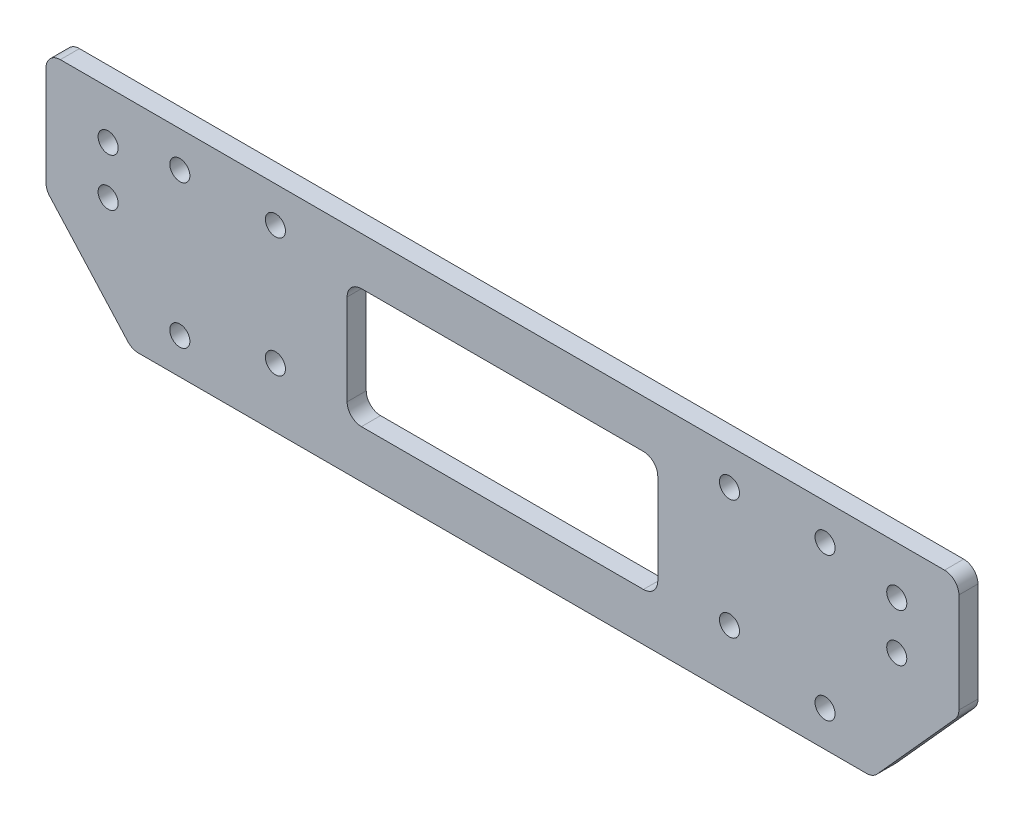
ISO-10303-21;
HEADER;
FILE_DESCRIPTION(('STEP AP214'),'2;1');
FILE_NAME('part.step','',(''),(''),'','','');
FILE_SCHEMA(('AUTOMOTIVE_DESIGN { 1 0 10303 214 1 1 1 1 }'));
ENDSEC;
DATA;
#1=APPLICATION_CONTEXT('core data for automotive mechanical design processes');
#2=APPLICATION_PROTOCOL_DEFINITION('international standard','automotive_design',2000,#1);
#3=PRODUCT_CONTEXT('',#1,'mechanical');
#4=PRODUCT('Part','Part','',(#3));
#5=PRODUCT_RELATED_PRODUCT_CATEGORY('part','',(#4));
#6=PRODUCT_DEFINITION_FORMATION('','',#4);
#7=PRODUCT_DEFINITION_CONTEXT('part definition',#1,'design');
#8=PRODUCT_DEFINITION('design','',#6,#7);
#9=PRODUCT_DEFINITION_SHAPE('','',#8);
#10=(LENGTH_UNIT() NAMED_UNIT(*) SI_UNIT(.MILLI.,.METRE.));
#11=(NAMED_UNIT(*) PLANE_ANGLE_UNIT() SI_UNIT($,.RADIAN.));
#12=(NAMED_UNIT(*) SI_UNIT($,.STERADIAN.) SOLID_ANGLE_UNIT());
#13=UNCERTAINTY_MEASURE_WITH_UNIT(LENGTH_MEASURE(1.E-05),#10,'distance_accuracy_value','');
#14=(GEOMETRIC_REPRESENTATION_CONTEXT(3) GLOBAL_UNCERTAINTY_ASSIGNED_CONTEXT((#13)) GLOBAL_UNIT_ASSIGNED_CONTEXT((#10,
#11,#12)) REPRESENTATION_CONTEXT('',''));
#15=CARTESIAN_POINT('',(0.,0.,0.));
#16=DIRECTION('',(0.,0.,1.));
#17=DIRECTION('',(1.,0.,0.));
#18=AXIS2_PLACEMENT_3D('',#15,#16,#17);
#19=CARTESIAN_POINT('',(0.,0.,4.));
#20=DIRECTION('',(0.,0.,-1.));
#21=DIRECTION('',(-1.,0.,0.));
#22=AXIS2_PLACEMENT_3D('',#19,#20,#21);
#23=PLANE('',#22);
#24=DIRECTION('',(-1.,0.,0.));
#25=VECTOR('',#24,1.);
#26=CARTESIAN_POINT('',(-32.5,12.5,4.));
#27=LINE('',#26,#25);
#28=CARTESIAN_POINT('',(29.5,12.5,4.));
#29=VERTEX_POINT('',#28);
#30=CARTESIAN_POINT('',(-29.5,12.5,4.));
#31=VERTEX_POINT('',#30);
#32=EDGE_CURVE('E289',#29,#31,#27,.T.);
#33=ORIENTED_EDGE('',*,*,#32,.F.);
#34=CARTESIAN_POINT('',(29.5,9.5,4.));
#35=DIRECTION('',(0.,0.,-1.));
#36=DIRECTION('',(-1.,0.,0.));
#37=AXIS2_PLACEMENT_3D('',#34,#35,#36);
#38=CIRCLE('',#37,3.);
#39=CARTESIAN_POINT('',(32.5,9.5,4.));
#40=VERTEX_POINT('',#39);
#41=EDGE_CURVE('E47',#29,#40,#38,.T.);
#42=ORIENTED_EDGE('',*,*,#41,.T.);
#43=DIRECTION('',(0.,1.,0.));
#44=VECTOR('',#43,1.);
#45=CARTESIAN_POINT('',(32.5,-12.5,4.));
#46=LINE('',#45,#44);
#47=CARTESIAN_POINT('',(32.5,-9.5,4.));
#48=VERTEX_POINT('',#47);
#49=EDGE_CURVE('E287',#48,#40,#46,.T.);
#50=ORIENTED_EDGE('',*,*,#49,.F.);
#51=CARTESIAN_POINT('',(29.5,-9.5,4.));
#52=DIRECTION('',(0.,0.,-1.));
#53=DIRECTION('',(-1.,0.,0.));
#54=AXIS2_PLACEMENT_3D('',#51,#52,#53);
#55=CIRCLE('',#54,3.);
#56=CARTESIAN_POINT('',(29.5,-12.5,4.));
#57=VERTEX_POINT('',#56);
#58=EDGE_CURVE('E272',#48,#57,#55,.T.);
#59=ORIENTED_EDGE('',*,*,#58,.T.);
#60=DIRECTION('',(1.,0.,0.));
#61=VECTOR('',#60,1.);
#62=CARTESIAN_POINT('',(-32.5,-12.5,4.));
#63=LINE('',#62,#61);
#64=CARTESIAN_POINT('',(-29.5,-12.5,4.));
#65=VERTEX_POINT('',#64);
#66=EDGE_CURVE('E336',#65,#57,#63,.T.);
#67=ORIENTED_EDGE('',*,*,#66,.F.);
#68=CARTESIAN_POINT('',(-29.5,-9.5,4.));
#69=DIRECTION('',(0.,0.,-1.));
#70=DIRECTION('',(-1.,0.,0.));
#71=AXIS2_PLACEMENT_3D('',#68,#69,#70);
#72=CIRCLE('',#71,3.);
#73=CARTESIAN_POINT('',(-32.5,-9.5,4.));
#74=VERTEX_POINT('',#73);
#75=EDGE_CURVE('E276',#65,#74,#72,.T.);
#76=ORIENTED_EDGE('',*,*,#75,.T.);
#77=DIRECTION('',(0.,-1.,0.));
#78=VECTOR('',#77,1.);
#79=CARTESIAN_POINT('',(-32.5,-12.5,4.));
#80=LINE('',#79,#78);
#81=CARTESIAN_POINT('',(-32.5,9.5,4.));
#82=VERTEX_POINT('',#81);
#83=EDGE_CURVE('E335',#82,#74,#80,.T.);
#84=ORIENTED_EDGE('',*,*,#83,.F.);
#85=CARTESIAN_POINT('',(-29.5,9.5,4.));
#86=DIRECTION('',(0.,0.,-1.));
#87=DIRECTION('',(-1.,0.,0.));
#88=AXIS2_PLACEMENT_3D('',#85,#86,#87);
#89=CIRCLE('',#88,3.);
#90=EDGE_CURVE('E280',#82,#31,#89,.T.);
#91=ORIENTED_EDGE('',*,*,#90,.T.);
#92=EDGE_LOOP('',(#33,#42,#50,#59,#67,#76,#84,#91));
#93=FACE_BOUND('',#92,.T.);
#94=DIRECTION('',(0.,-1.,0.));
#95=VECTOR('',#94,1.);
#96=CARTESIAN_POINT('',(-95.5,22.5,4.));
#97=LINE('',#96,#95);
#98=CARTESIAN_POINT('',(-95.5,19.5,4.));
#99=VERTEX_POINT('',#98);
#100=CARTESIAN_POINT('',(-95.5,-1.34879198430876,4.));
#101=VERTEX_POINT('',#100);
#102=EDGE_CURVE('E180',#99,#101,#97,.T.);
#103=ORIENTED_EDGE('',*,*,#102,.T.);
#104=CARTESIAN_POINT('',(-92.5,-1.34879198430876,4.));
#105=DIRECTION('',(0.,0.,-1.));
#106=DIRECTION('',(-1.,0.,0.));
#107=AXIS2_PLACEMENT_3D('',#104,#105,#106);
#108=CIRCLE('',#107,3.);
#109=CARTESIAN_POINT('',(-94.7298824387415,-3.35568617917611,4.));
#110=VERTEX_POINT('',#109);
#111=EDGE_CURVE('E218',#101,#110,#108,.F.);
#112=ORIENTED_EDGE('',*,*,#111,.T.);
#113=DIRECTION('',(0.66896473162245,-0.743294146247166,0.));
#114=VECTOR('',#113,1.);
#115=CARTESIAN_POINT('',(-95.5,-2.5,4.));
#116=LINE('',#115,#114);
#117=CARTESIAN_POINT('',(-78.3937952246194,-21.5068941948673,4.));
#118=VERTEX_POINT('',#117);
#119=EDGE_CURVE('E197',#110,#118,#116,.T.);
#120=ORIENTED_EDGE('',*,*,#119,.T.);
#121=CARTESIAN_POINT('',(-76.1639127858779,-19.5,4.));
#122=DIRECTION('',(0.,0.,-1.));
#123=DIRECTION('',(-1.,0.,0.));
#124=AXIS2_PLACEMENT_3D('',#121,#122,#123);
#125=CIRCLE('',#124,3.);
#126=CARTESIAN_POINT('',(-76.1639127858779,-22.5,4.));
#127=VERTEX_POINT('',#126);
#128=EDGE_CURVE('E216',#118,#127,#125,.F.);
#129=ORIENTED_EDGE('',*,*,#128,.T.);
#130=DIRECTION('',(1.,0.,0.));
#131=VECTOR('',#130,1.);
#132=CARTESIAN_POINT('',(-77.5,-22.5,4.));
#133=LINE('',#132,#131);
#134=CARTESIAN_POINT('',(76.1639127858779,-22.5,4.));
#135=VERTEX_POINT('',#134);
#136=EDGE_CURVE('E311',#127,#135,#133,.T.);
#137=ORIENTED_EDGE('',*,*,#136,.T.);
#138=CARTESIAN_POINT('',(76.1639127858779,-19.5,4.));
#139=DIRECTION('',(0.,0.,-1.));
#140=DIRECTION('',(-1.,0.,0.));
#141=AXIS2_PLACEMENT_3D('',#138,#139,#140);
#142=CIRCLE('',#141,3.);
#143=CARTESIAN_POINT('',(78.3937952246194,-21.5068941948673,4.));
#144=VERTEX_POINT('',#143);
#145=EDGE_CURVE('E214',#135,#144,#142,.F.);
#146=ORIENTED_EDGE('',*,*,#145,.T.);
#147=DIRECTION('',(0.66896473162245,0.743294146247166,0.));
#148=VECTOR('',#147,1.);
#149=CARTESIAN_POINT('',(95.5,-2.5,4.));
#150=LINE('',#149,#148);
#151=CARTESIAN_POINT('',(94.7298824387415,-3.35568617917611,4.));
#152=VERTEX_POINT('',#151);
#153=EDGE_CURVE('E407',#144,#152,#150,.T.);
#154=ORIENTED_EDGE('',*,*,#153,.T.);
#155=CARTESIAN_POINT('',(92.5,-1.34879198430876,4.));
#156=DIRECTION('',(0.,0.,-1.));
#157=DIRECTION('',(-1.,0.,0.));
#158=AXIS2_PLACEMENT_3D('',#155,#156,#157);
#159=CIRCLE('',#158,3.);
#160=CARTESIAN_POINT('',(95.5,-1.34879198430876,4.));
#161=VERTEX_POINT('',#160);
#162=EDGE_CURVE('E212',#152,#161,#159,.F.);
#163=ORIENTED_EDGE('',*,*,#162,.T.);
#164=DIRECTION('',(0.,1.,0.));
#165=VECTOR('',#164,1.);
#166=CARTESIAN_POINT('',(95.5,22.5,4.));
#167=LINE('',#166,#165);
#168=CARTESIAN_POINT('',(95.5,19.5,4.));
#169=VERTEX_POINT('',#168);
#170=EDGE_CURVE('E413',#161,#169,#167,.T.);
#171=ORIENTED_EDGE('',*,*,#170,.T.);
#172=CARTESIAN_POINT('',(92.5,19.5,4.));
#173=DIRECTION('',(0.,0.,-1.));
#174=DIRECTION('',(-1.,0.,0.));
#175=AXIS2_PLACEMENT_3D('',#172,#173,#174);
#176=CIRCLE('',#175,3.);
#177=CARTESIAN_POINT('',(92.5,22.5,4.));
#178=VERTEX_POINT('',#177);
#179=EDGE_CURVE('E187',#169,#178,#176,.F.);
#180=ORIENTED_EDGE('',*,*,#179,.T.);
#181=DIRECTION('',(-1.,0.,0.));
#182=VECTOR('',#181,1.);
#183=CARTESIAN_POINT('',(-77.5,22.5,4.));
#184=LINE('',#183,#182);
#185=CARTESIAN_POINT('',(-92.5,22.5,4.));
#186=VERTEX_POINT('',#185);
#187=EDGE_CURVE('E182',#178,#186,#184,.T.);
#188=ORIENTED_EDGE('',*,*,#187,.T.);
#189=CARTESIAN_POINT('',(-92.5,19.5,4.));
#190=DIRECTION('',(0.,0.,-1.));
#191=DIRECTION('',(-1.,0.,0.));
#192=AXIS2_PLACEMENT_3D('',#189,#190,#191);
#193=CIRCLE('',#192,3.);
#194=EDGE_CURVE('E177',#186,#99,#193,.F.);
#195=ORIENTED_EDGE('',*,*,#194,.T.);
#196=EDGE_LOOP('',(#103,#112,#120,#129,#137,#146,#154,#163,#171,#180,#188,#195));
#197=FACE_BOUND('',#196,.T.);
#198=CARTESIAN_POINT('',(-67.5,15.,4.));
#199=DIRECTION('',(0.,0.,1.));
#200=DIRECTION('',(1.,0.,0.));
#201=AXIS2_PLACEMENT_3D('',#198,#199,#200);
#202=CIRCLE('',#201,2.1);
#203=CARTESIAN_POINT('',(-65.4,15.,4.));
#204=VERTEX_POINT('',#203);
#205=EDGE_CURVE('E388',#204,#204,#202,.T.);
#206=ORIENTED_EDGE('',*,*,#205,.F.);
#207=EDGE_LOOP('',(#206));
#208=FACE_BOUND('',#207,.T.);
#209=CARTESIAN_POINT('',(-67.5,-15.,4.));
#210=DIRECTION('',(0.,0.,1.));
#211=DIRECTION('',(1.,0.,0.));
#212=AXIS2_PLACEMENT_3D('',#209,#210,#211);
#213=CIRCLE('',#212,2.1);
#214=CARTESIAN_POINT('',(-65.4,-15.,4.));
#215=VERTEX_POINT('',#214);
#216=EDGE_CURVE('E382',#215,#215,#213,.T.);
#217=ORIENTED_EDGE('',*,*,#216,.F.);
#218=EDGE_LOOP('',(#217));
#219=FACE_BOUND('',#218,.T.);
#220=CARTESIAN_POINT('',(47.5,15.,4.));
#221=DIRECTION('',(0.,0.,1.));
#222=DIRECTION('',(1.,0.,0.));
#223=AXIS2_PLACEMENT_3D('',#220,#221,#222);
#224=CIRCLE('',#223,2.1);
#225=CARTESIAN_POINT('',(49.6,15.,4.));
#226=VERTEX_POINT('',#225);
#227=EDGE_CURVE('E376',#226,#226,#224,.T.);
#228=ORIENTED_EDGE('',*,*,#227,.F.);
#229=EDGE_LOOP('',(#228));
#230=FACE_BOUND('',#229,.T.);
#231=CARTESIAN_POINT('',(-47.5,15.,4.));
#232=DIRECTION('',(0.,0.,1.));
#233=DIRECTION('',(1.,0.,0.));
#234=AXIS2_PLACEMENT_3D('',#231,#232,#233);
#235=CIRCLE('',#234,2.1);
#236=CARTESIAN_POINT('',(-45.4,15.,4.));
#237=VERTEX_POINT('',#236);
#238=EDGE_CURVE('E370',#237,#237,#235,.T.);
#239=ORIENTED_EDGE('',*,*,#238,.F.);
#240=EDGE_LOOP('',(#239));
#241=FACE_BOUND('',#240,.T.);
#242=CARTESIAN_POINT('',(67.5,15.,4.));
#243=DIRECTION('',(0.,0.,1.));
#244=DIRECTION('',(-1.,0.,0.));
#245=AXIS2_PLACEMENT_3D('',#242,#243,#244);
#246=CIRCLE('',#245,2.0999999999999);
#247=CARTESIAN_POINT('',(65.4000000000001,15.,4.));
#248=VERTEX_POINT('',#247);
#249=EDGE_CURVE('E364',#248,#248,#246,.T.);
#250=ORIENTED_EDGE('',*,*,#249,.F.);
#251=EDGE_LOOP('',(#250));
#252=FACE_BOUND('',#251,.T.);
#253=CARTESIAN_POINT('',(67.5,-15.,4.));
#254=DIRECTION('',(0.,0.,1.));
#255=DIRECTION('',(-1.,0.,0.));
#256=AXIS2_PLACEMENT_3D('',#253,#254,#255);
#257=CIRCLE('',#256,2.09999999999996);
#258=CARTESIAN_POINT('',(65.4,-15.,4.));
#259=VERTEX_POINT('',#258);
#260=EDGE_CURVE('E358',#259,#259,#257,.T.);
#261=ORIENTED_EDGE('',*,*,#260,.F.);
#262=EDGE_LOOP('',(#261));
#263=FACE_BOUND('',#262,.T.);
#264=CARTESIAN_POINT('',(47.5,-9.99999999999999,4.));
#265=DIRECTION('',(0.,0.,1.));
#266=DIRECTION('',(1.,0.,0.));
#267=AXIS2_PLACEMENT_3D('',#264,#265,#266);
#268=CIRCLE('',#267,2.1);
#269=CARTESIAN_POINT('',(49.6,-9.99999999999999,4.));
#270=VERTEX_POINT('',#269);
#271=EDGE_CURVE('E352',#270,#270,#268,.T.);
#272=ORIENTED_EDGE('',*,*,#271,.F.);
#273=EDGE_LOOP('',(#272));
#274=FACE_BOUND('',#273,.T.);
#275=CARTESIAN_POINT('',(-47.5,-10.,4.));
#276=DIRECTION('',(0.,0.,1.));
#277=DIRECTION('',(1.,0.,0.));
#278=AXIS2_PLACEMENT_3D('',#275,#276,#277);
#279=CIRCLE('',#278,2.1);
#280=CARTESIAN_POINT('',(-45.4,-10.,4.));
#281=VERTEX_POINT('',#280);
#282=EDGE_CURVE('E346',#281,#281,#279,.T.);
#283=ORIENTED_EDGE('',*,*,#282,.F.);
#284=EDGE_LOOP('',(#283));
#285=FACE_BOUND('',#284,.T.);
#286=CARTESIAN_POINT('',(-82.5,2.5,4.));
#287=DIRECTION('',(0.,0.,1.));
#288=DIRECTION('',(1.,0.,0.));
#289=AXIS2_PLACEMENT_3D('',#286,#287,#288);
#290=CIRCLE('',#289,2.1);
#291=CARTESIAN_POINT('',(-80.4,2.5,4.));
#292=VERTEX_POINT('',#291);
#293=EDGE_CURVE('E433',#292,#292,#290,.T.);
#294=ORIENTED_EDGE('',*,*,#293,.F.);
#295=EDGE_LOOP('',(#294));
#296=FACE_BOUND('',#295,.T.);
#297=CARTESIAN_POINT('',(-82.5,12.5,4.));
#298=DIRECTION('',(0.,0.,1.));
#299=DIRECTION('',(1.,0.,0.));
#300=AXIS2_PLACEMENT_3D('',#297,#298,#299);
#301=CIRCLE('',#300,2.1);
#302=CARTESIAN_POINT('',(-80.4,12.5,4.));
#303=VERTEX_POINT('',#302);
#304=EDGE_CURVE('E785',#303,#303,#301,.T.);
#305=ORIENTED_EDGE('',*,*,#304,.F.);
#306=EDGE_LOOP('',(#305));
#307=FACE_BOUND('',#306,.T.);
#308=CARTESIAN_POINT('',(82.5,2.5,4.));
#309=DIRECTION('',(0.,0.,1.));
#310=DIRECTION('',(-1.,0.,0.));
#311=AXIS2_PLACEMENT_3D('',#308,#309,#310);
#312=CIRCLE('',#311,2.1);
#313=CARTESIAN_POINT('',(80.4,2.5,4.));
#314=VERTEX_POINT('',#313);
#315=EDGE_CURVE('E430',#314,#314,#312,.T.);
#316=ORIENTED_EDGE('',*,*,#315,.F.);
#317=EDGE_LOOP('',(#316));
#318=FACE_BOUND('',#317,.T.);
#319=CARTESIAN_POINT('',(82.5,12.5,4.));
#320=DIRECTION('',(0.,0.,1.));
#321=DIRECTION('',(-1.,0.,0.));
#322=AXIS2_PLACEMENT_3D('',#319,#320,#321);
#323=CIRCLE('',#322,2.1);
#324=CARTESIAN_POINT('',(80.4,12.5,4.));
#325=VERTEX_POINT('',#324);
#326=EDGE_CURVE('E416',#325,#325,#323,.T.);
#327=ORIENTED_EDGE('',*,*,#326,.F.);
#328=EDGE_LOOP('',(#327));
#329=FACE_BOUND('',#328,.T.);
#330=ADVANCED_FACE('F39',(#93,#197,#208,#219,#230,#241,#252,#263,#274,#285,#296,#307,#318,#329),
#23,.F.);
#331=CARTESIAN_POINT('',(0.,0.,0.));
#332=DIRECTION('',(0.,0.,-1.));
#333=DIRECTION('',(-1.,0.,0.));
#334=AXIS2_PLACEMENT_3D('',#331,#332,#333);
#335=PLANE('',#334);
#336=DIRECTION('',(0.,-1.,0.));
#337=VECTOR('',#336,1.);
#338=CARTESIAN_POINT('',(32.5,0.,0.));
#339=LINE('',#338,#337);
#340=CARTESIAN_POINT('',(32.5,9.5,0.));
#341=VERTEX_POINT('',#340);
#342=CARTESIAN_POINT('',(32.5,-9.5,0.));
#343=VERTEX_POINT('',#342);
#344=EDGE_CURVE('E203',#341,#343,#339,.T.);
#345=ORIENTED_EDGE('',*,*,#344,.F.);
#346=CARTESIAN_POINT('',(29.5,9.5,0.));
#347=DIRECTION('',(0.,0.,-1.));
#348=DIRECTION('',(-1.,0.,0.));
#349=AXIS2_PLACEMENT_3D('',#346,#347,#348);
#350=CIRCLE('',#349,3.);
#351=CARTESIAN_POINT('',(29.5,12.5,0.));
#352=VERTEX_POINT('',#351);
#353=EDGE_CURVE('E11',#341,#352,#350,.F.);
#354=ORIENTED_EDGE('',*,*,#353,.T.);
#355=DIRECTION('',(1.,0.,0.));
#356=VECTOR('',#355,1.);
#357=CARTESIAN_POINT('',(0.,12.5,0.));
#358=LINE('',#357,#356);
#359=CARTESIAN_POINT('',(-29.5,12.5,0.));
#360=VERTEX_POINT('',#359);
#361=EDGE_CURVE('E305',#360,#352,#358,.T.);
#362=ORIENTED_EDGE('',*,*,#361,.F.);
#363=CARTESIAN_POINT('',(-29.5,9.5,0.));
#364=DIRECTION('',(0.,0.,-1.));
#365=DIRECTION('',(-1.,0.,0.));
#366=AXIS2_PLACEMENT_3D('',#363,#364,#365);
#367=CIRCLE('',#366,3.);
#368=CARTESIAN_POINT('',(-32.5,9.5,0.));
#369=VERTEX_POINT('',#368);
#370=EDGE_CURVE('E282',#360,#369,#367,.F.);
#371=ORIENTED_EDGE('',*,*,#370,.T.);
#372=DIRECTION('',(0.,1.,0.));
#373=VECTOR('',#372,1.);
#374=CARTESIAN_POINT('',(-32.5,0.,0.));
#375=LINE('',#374,#373);
#376=CARTESIAN_POINT('',(-32.5,-9.5,0.));
#377=VERTEX_POINT('',#376);
#378=EDGE_CURVE('E310',#377,#369,#375,.T.);
#379=ORIENTED_EDGE('',*,*,#378,.F.);
#380=CARTESIAN_POINT('',(-29.5,-9.5,0.));
#381=DIRECTION('',(0.,0.,-1.));
#382=DIRECTION('',(-1.,0.,0.));
#383=AXIS2_PLACEMENT_3D('',#380,#381,#382);
#384=CIRCLE('',#383,3.);
#385=CARTESIAN_POINT('',(-29.5,-12.5,0.));
#386=VERTEX_POINT('',#385);
#387=EDGE_CURVE('E278',#377,#386,#384,.F.);
#388=ORIENTED_EDGE('',*,*,#387,.T.);
#389=DIRECTION('',(-1.,0.,0.));
#390=VECTOR('',#389,1.);
#391=CARTESIAN_POINT('',(0.,-12.5,0.));
#392=LINE('',#391,#390);
#393=CARTESIAN_POINT('',(29.5,-12.5,0.));
#394=VERTEX_POINT('',#393);
#395=EDGE_CURVE('E207',#394,#386,#392,.T.);
#396=ORIENTED_EDGE('',*,*,#395,.F.);
#397=CARTESIAN_POINT('',(29.5,-9.5,0.));
#398=DIRECTION('',(0.,0.,-1.));
#399=DIRECTION('',(-1.,0.,0.));
#400=AXIS2_PLACEMENT_3D('',#397,#398,#399);
#401=CIRCLE('',#400,3.);
#402=EDGE_CURVE('E274',#394,#343,#401,.F.);
#403=ORIENTED_EDGE('',*,*,#402,.T.);
#404=EDGE_LOOP('',(#345,#354,#362,#371,#379,#388,#396,#403));
#405=FACE_BOUND('',#404,.T.);
#406=CARTESIAN_POINT('',(47.5,-9.99999999999999,0.));
#407=DIRECTION('',(0.,0.,1.));
#408=DIRECTION('',(1.,0.,0.));
#409=AXIS2_PLACEMENT_3D('',#406,#407,#408);
#410=CIRCLE('',#409,2.1);
#411=CARTESIAN_POINT('',(49.6,-9.99999999999999,0.));
#412=VERTEX_POINT('',#411);
#413=EDGE_CURVE('E349',#412,#412,#410,.T.);
#414=ORIENTED_EDGE('',*,*,#413,.T.);
#415=EDGE_LOOP('',(#414));
#416=FACE_BOUND('',#415,.T.);
#417=CARTESIAN_POINT('',(67.5,15.,0.));
#418=DIRECTION('',(0.,0.,1.));
#419=DIRECTION('',(-1.,0.,0.));
#420=AXIS2_PLACEMENT_3D('',#417,#418,#419);
#421=CIRCLE('',#420,2.0999999999999);
#422=CARTESIAN_POINT('',(65.4000000000001,15.,0.));
#423=VERTEX_POINT('',#422);
#424=EDGE_CURVE('E361',#423,#423,#421,.T.);
#425=ORIENTED_EDGE('',*,*,#424,.T.);
#426=EDGE_LOOP('',(#425));
#427=FACE_BOUND('',#426,.T.);
#428=CARTESIAN_POINT('',(47.5,15.,0.));
#429=DIRECTION('',(0.,0.,1.));
#430=DIRECTION('',(1.,0.,0.));
#431=AXIS2_PLACEMENT_3D('',#428,#429,#430);
#432=CIRCLE('',#431,2.1);
#433=CARTESIAN_POINT('',(49.6,15.,0.));
#434=VERTEX_POINT('',#433);
#435=EDGE_CURVE('E373',#434,#434,#432,.T.);
#436=ORIENTED_EDGE('',*,*,#435,.T.);
#437=EDGE_LOOP('',(#436));
#438=FACE_BOUND('',#437,.T.);
#439=CARTESIAN_POINT('',(-67.5,15.,0.));
#440=DIRECTION('',(0.,0.,1.));
#441=DIRECTION('',(1.,0.,0.));
#442=AXIS2_PLACEMENT_3D('',#439,#440,#441);
#443=CIRCLE('',#442,2.1);
#444=CARTESIAN_POINT('',(-65.4,15.,0.));
#445=VERTEX_POINT('',#444);
#446=EDGE_CURVE('E385',#445,#445,#443,.T.);
#447=ORIENTED_EDGE('',*,*,#446,.T.);
#448=EDGE_LOOP('',(#447));
#449=FACE_BOUND('',#448,.T.);
#450=DIRECTION('',(0.66896473162245,-0.743294146247166,0.));
#451=VECTOR('',#450,1.);
#452=CARTESIAN_POINT('',(-95.5,-2.5,0.));
#453=LINE('',#452,#451);
#454=CARTESIAN_POINT('',(-94.7298824387415,-3.35568617917611,0.));
#455=VERTEX_POINT('',#454);
#456=CARTESIAN_POINT('',(-78.3937952246194,-21.5068941948673,0.));
#457=VERTEX_POINT('',#456);
#458=EDGE_CURVE('E297',#455,#457,#453,.T.);
#459=ORIENTED_EDGE('',*,*,#458,.F.);
#460=CARTESIAN_POINT('',(-92.5,-1.34879198430876,0.));
#461=DIRECTION('',(0.,0.,-1.));
#462=DIRECTION('',(-1.,0.,0.));
#463=AXIS2_PLACEMENT_3D('',#460,#461,#462);
#464=CIRCLE('',#463,3.);
#465=CARTESIAN_POINT('',(-95.5,-1.34879198430876,0.));
#466=VERTEX_POINT('',#465);
#467=EDGE_CURVE('E231',#455,#466,#464,.T.);
#468=ORIENTED_EDGE('',*,*,#467,.T.);
#469=DIRECTION('',(0.,-1.,0.));
#470=VECTOR('',#469,1.);
#471=CARTESIAN_POINT('',(-95.5,22.5,0.));
#472=LINE('',#471,#470);
#473=CARTESIAN_POINT('',(-95.5,19.5,0.));
#474=VERTEX_POINT('',#473);
#475=EDGE_CURVE('E779',#474,#466,#472,.T.);
#476=ORIENTED_EDGE('',*,*,#475,.F.);
#477=CARTESIAN_POINT('',(-92.5,19.5,0.));
#478=DIRECTION('',(0.,0.,-1.));
#479=DIRECTION('',(-1.,0.,0.));
#480=AXIS2_PLACEMENT_3D('',#477,#478,#479);
#481=CIRCLE('',#480,3.);
#482=CARTESIAN_POINT('',(-92.5,22.5,0.));
#483=VERTEX_POINT('',#482);
#484=EDGE_CURVE('E202',#474,#483,#481,.T.);
#485=ORIENTED_EDGE('',*,*,#484,.T.);
#486=DIRECTION('',(-1.,0.,0.));
#487=VECTOR('',#486,1.);
#488=CARTESIAN_POINT('',(-77.5,22.5,0.));
#489=LINE('',#488,#487);
#490=CARTESIAN_POINT('',(92.5,22.5,0.));
#491=VERTEX_POINT('',#490);
#492=EDGE_CURVE('E391',#491,#483,#489,.T.);
#493=ORIENTED_EDGE('',*,*,#492,.F.);
#494=CARTESIAN_POINT('',(92.5,19.5,0.));
#495=DIRECTION('',(0.,0.,-1.));
#496=DIRECTION('',(-1.,0.,0.));
#497=AXIS2_PLACEMENT_3D('',#494,#495,#496);
#498=CIRCLE('',#497,3.);
#499=CARTESIAN_POINT('',(95.5,19.5,0.));
#500=VERTEX_POINT('',#499);
#501=EDGE_CURVE('E225',#491,#500,#498,.T.);
#502=ORIENTED_EDGE('',*,*,#501,.T.);
#503=DIRECTION('',(0.,1.,0.));
#504=VECTOR('',#503,1.);
#505=CARTESIAN_POINT('',(95.5,22.5,0.));
#506=LINE('',#505,#504);
#507=CARTESIAN_POINT('',(95.5,-1.34879198430876,0.));
#508=VERTEX_POINT('',#507);
#509=EDGE_CURVE('E423',#508,#500,#506,.T.);
#510=ORIENTED_EDGE('',*,*,#509,.F.);
#511=CARTESIAN_POINT('',(92.5,-1.34879198430876,0.));
#512=DIRECTION('',(0.,0.,-1.));
#513=DIRECTION('',(-1.,0.,0.));
#514=AXIS2_PLACEMENT_3D('',#511,#512,#513);
#515=CIRCLE('',#514,3.);
#516=CARTESIAN_POINT('',(94.7298824387415,-3.35568617917611,0.));
#517=VERTEX_POINT('',#516);
#518=EDGE_CURVE('E227',#508,#517,#515,.T.);
#519=ORIENTED_EDGE('',*,*,#518,.T.);
#520=DIRECTION('',(0.66896473162245,0.743294146247166,0.));
#521=VECTOR('',#520,1.);
#522=CARTESIAN_POINT('',(95.5,-2.5,0.));
#523=LINE('',#522,#521);
#524=CARTESIAN_POINT('',(78.3937952246194,-21.5068941948673,0.));
#525=VERTEX_POINT('',#524);
#526=EDGE_CURVE('E419',#525,#517,#523,.T.);
#527=ORIENTED_EDGE('',*,*,#526,.F.);
#528=CARTESIAN_POINT('',(76.1639127858779,-19.5,0.));
#529=DIRECTION('',(0.,0.,-1.));
#530=DIRECTION('',(-1.,0.,0.));
#531=AXIS2_PLACEMENT_3D('',#528,#529,#530);
#532=CIRCLE('',#531,3.);
#533=CARTESIAN_POINT('',(76.1639127858779,-22.5,0.));
#534=VERTEX_POINT('',#533);
#535=EDGE_CURVE('E54',#525,#534,#532,.T.);
#536=ORIENTED_EDGE('',*,*,#535,.T.);
#537=DIRECTION('',(1.,0.,0.));
#538=VECTOR('',#537,1.);
#539=CARTESIAN_POINT('',(-77.5,-22.5,0.));
#540=LINE('',#539,#538);
#541=CARTESIAN_POINT('',(-76.1639127858779,-22.5,0.));
#542=VERTEX_POINT('',#541);
#543=EDGE_CURVE('E318',#542,#534,#540,.T.);
#544=ORIENTED_EDGE('',*,*,#543,.F.);
#545=CARTESIAN_POINT('',(-76.1639127858779,-19.5,0.));
#546=DIRECTION('',(0.,0.,-1.));
#547=DIRECTION('',(-1.,0.,0.));
#548=AXIS2_PLACEMENT_3D('',#545,#546,#547);
#549=CIRCLE('',#548,3.);
#550=EDGE_CURVE('E62',#542,#457,#549,.T.);
#551=ORIENTED_EDGE('',*,*,#550,.T.);
#552=EDGE_LOOP('',(#459,#468,#476,#485,#493,#502,#510,#519,#527,#536,#544,#551));
#553=FACE_BOUND('',#552,.T.);
#554=CARTESIAN_POINT('',(-67.5,-15.,0.));
#555=DIRECTION('',(0.,0.,1.));
#556=DIRECTION('',(1.,0.,0.));
#557=AXIS2_PLACEMENT_3D('',#554,#555,#556);
#558=CIRCLE('',#557,2.1);
#559=CARTESIAN_POINT('',(-65.4,-15.,0.));
#560=VERTEX_POINT('',#559);
#561=EDGE_CURVE('E379',#560,#560,#558,.T.);
#562=ORIENTED_EDGE('',*,*,#561,.T.);
#563=EDGE_LOOP('',(#562));
#564=FACE_BOUND('',#563,.T.);
#565=CARTESIAN_POINT('',(-47.5,15.,0.));
#566=DIRECTION('',(0.,0.,1.));
#567=DIRECTION('',(1.,0.,0.));
#568=AXIS2_PLACEMENT_3D('',#565,#566,#567);
#569=CIRCLE('',#568,2.1);
#570=CARTESIAN_POINT('',(-45.4,15.,0.));
#571=VERTEX_POINT('',#570);
#572=EDGE_CURVE('E367',#571,#571,#569,.T.);
#573=ORIENTED_EDGE('',*,*,#572,.T.);
#574=EDGE_LOOP('',(#573));
#575=FACE_BOUND('',#574,.T.);
#576=CARTESIAN_POINT('',(67.5,-15.,0.));
#577=DIRECTION('',(0.,0.,1.));
#578=DIRECTION('',(-1.,0.,0.));
#579=AXIS2_PLACEMENT_3D('',#576,#577,#578);
#580=CIRCLE('',#579,2.09999999999996);
#581=CARTESIAN_POINT('',(65.4,-15.,0.));
#582=VERTEX_POINT('',#581);
#583=EDGE_CURVE('E355',#582,#582,#580,.T.);
#584=ORIENTED_EDGE('',*,*,#583,.T.);
#585=EDGE_LOOP('',(#584));
#586=FACE_BOUND('',#585,.T.);
#587=CARTESIAN_POINT('',(-47.5,-10.,0.));
#588=DIRECTION('',(0.,0.,1.));
#589=DIRECTION('',(1.,0.,0.));
#590=AXIS2_PLACEMENT_3D('',#587,#588,#589);
#591=CIRCLE('',#590,2.1);
#592=CARTESIAN_POINT('',(-45.4,-10.,0.));
#593=VERTEX_POINT('',#592);
#594=EDGE_CURVE('E342',#593,#593,#591,.T.);
#595=ORIENTED_EDGE('',*,*,#594,.T.);
#596=EDGE_LOOP('',(#595));
#597=FACE_BOUND('',#596,.T.);
#598=CARTESIAN_POINT('',(-82.5,2.5,0.));
#599=DIRECTION('',(0.,0.,1.));
#600=DIRECTION('',(1.,0.,0.));
#601=AXIS2_PLACEMENT_3D('',#598,#599,#600);
#602=CIRCLE('',#601,2.1);
#603=CARTESIAN_POINT('',(-80.4,2.5,0.));
#604=VERTEX_POINT('',#603);
#605=EDGE_CURVE('E788',#604,#604,#602,.T.);
#606=ORIENTED_EDGE('',*,*,#605,.T.);
#607=EDGE_LOOP('',(#606));
#608=FACE_BOUND('',#607,.T.);
#609=CARTESIAN_POINT('',(-82.5,12.5,0.));
#610=DIRECTION('',(0.,0.,1.));
#611=DIRECTION('',(1.,0.,0.));
#612=AXIS2_PLACEMENT_3D('',#609,#610,#611);
#613=CIRCLE('',#612,2.1);
#614=CARTESIAN_POINT('',(-80.4,12.5,0.));
#615=VERTEX_POINT('',#614);
#616=EDGE_CURVE('E198',#615,#615,#613,.T.);
#617=ORIENTED_EDGE('',*,*,#616,.T.);
#618=EDGE_LOOP('',(#617));
#619=FACE_BOUND('',#618,.T.);
#620=CARTESIAN_POINT('',(82.5,2.5,0.));
#621=DIRECTION('',(0.,0.,1.));
#622=DIRECTION('',(-1.,0.,0.));
#623=AXIS2_PLACEMENT_3D('',#620,#621,#622);
#624=CIRCLE('',#623,2.1);
#625=CARTESIAN_POINT('',(80.4,2.5,0.));
#626=VERTEX_POINT('',#625);
#627=EDGE_CURVE('E428',#626,#626,#624,.T.);
#628=ORIENTED_EDGE('',*,*,#627,.T.);
#629=EDGE_LOOP('',(#628));
#630=FACE_BOUND('',#629,.T.);
#631=CARTESIAN_POINT('',(82.5,12.5,0.));
#632=DIRECTION('',(0.,0.,1.));
#633=DIRECTION('',(-1.,0.,0.));
#634=AXIS2_PLACEMENT_3D('',#631,#632,#633);
#635=CIRCLE('',#634,2.1);
#636=CARTESIAN_POINT('',(80.4,12.5,0.));
#637=VERTEX_POINT('',#636);
#638=EDGE_CURVE('E412',#637,#637,#635,.T.);
#639=ORIENTED_EDGE('',*,*,#638,.T.);
#640=EDGE_LOOP('',(#639));
#641=FACE_BOUND('',#640,.T.);
#642=ADVANCED_FACE('F303',(#405,#416,#427,#438,#449,#553,#564,#575,#586,#597,#608,#619,#630,
#641),#335,.T.);
#643=CARTESIAN_POINT('',(-77.5,22.5,4.));
#644=DIRECTION('',(0.,-1.,0.));
#645=DIRECTION('',(0.,0.,-1.));
#646=AXIS2_PLACEMENT_3D('',#643,#644,#645);
#647=PLANE('',#646);
#648=ORIENTED_EDGE('',*,*,#187,.F.);
#649=DIRECTION('',(0.,0.,1.));
#650=VECTOR('',#649,1.);
#651=CARTESIAN_POINT('',(92.5,22.5,0.));
#652=LINE('',#651,#650);
#653=EDGE_CURVE('E250',#178,#491,#652,.F.);
#654=ORIENTED_EDGE('',*,*,#653,.T.);
#655=ORIENTED_EDGE('',*,*,#492,.T.);
#656=DIRECTION('',(0.,0.,1.));
#657=VECTOR('',#656,1.);
#658=CARTESIAN_POINT('',(-92.5,22.5,4.));
#659=LINE('',#658,#657);
#660=EDGE_CURVE('E248',#483,#186,#659,.T.);
#661=ORIENTED_EDGE('',*,*,#660,.T.);
#662=EDGE_LOOP('',(#648,#654,#655,#661));
#663=FACE_BOUND('',#662,.T.);
#664=ADVANCED_FACE('F507',(#663),#647,.F.);
#665=CARTESIAN_POINT('',(-77.5,-22.5,4.));
#666=DIRECTION('',(0.,1.,0.));
#667=DIRECTION('',(0.,0.,1.));
#668=AXIS2_PLACEMENT_3D('',#665,#666,#667);
#669=PLANE('',#668);
#670=ORIENTED_EDGE('',*,*,#136,.F.);
#671=DIRECTION('',(0.,0.,-1.));
#672=VECTOR('',#671,1.);
#673=CARTESIAN_POINT('',(-76.1639127858779,-22.5,0.));
#674=LINE('',#673,#672);
#675=EDGE_CURVE('E235',#127,#542,#674,.T.);
#676=ORIENTED_EDGE('',*,*,#675,.T.);
#677=ORIENTED_EDGE('',*,*,#543,.T.);
#678=DIRECTION('',(0.,0.,-1.));
#679=VECTOR('',#678,1.);
#680=CARTESIAN_POINT('',(76.1639127858779,-22.5,4.));
#681=LINE('',#680,#679);
#682=EDGE_CURVE('E233',#534,#135,#681,.F.);
#683=ORIENTED_EDGE('',*,*,#682,.T.);
#684=EDGE_LOOP('',(#670,#676,#677,#683));
#685=FACE_BOUND('',#684,.T.);
#686=ADVANCED_FACE('F400',(#685),#669,.F.);
#687=CARTESIAN_POINT('',(-67.5,15.,4.));
#688=DIRECTION('',(0.,0.,-1.));
#689=DIRECTION('',(-1.,0.,0.));
#690=AXIS2_PLACEMENT_3D('',#687,#688,#689);
#691=CYLINDRICAL_SURFACE('',#690,2.1);
#692=ORIENTED_EDGE('',*,*,#205,.T.);
#693=EDGE_LOOP('',(#692));
#694=FACE_BOUND('',#693,.T.);
#695=ORIENTED_EDGE('',*,*,#446,.F.);
#696=EDGE_LOOP('',(#695));
#697=FACE_BOUND('',#696,.T.);
#698=ADVANCED_FACE('F500',(#694,#697),#691,.F.);
#699=CARTESIAN_POINT('',(-67.5,-15.,4.));
#700=DIRECTION('',(0.,0.,-1.));
#701=DIRECTION('',(-1.,0.,0.));
#702=AXIS2_PLACEMENT_3D('',#699,#700,#701);
#703=CYLINDRICAL_SURFACE('',#702,2.1);
#704=ORIENTED_EDGE('',*,*,#216,.T.);
#705=EDGE_LOOP('',(#704));
#706=FACE_BOUND('',#705,.T.);
#707=ORIENTED_EDGE('',*,*,#561,.F.);
#708=EDGE_LOOP('',(#707));
#709=FACE_BOUND('',#708,.T.);
#710=ADVANCED_FACE('F496',(#706,#709),#703,.F.);
#711=CARTESIAN_POINT('',(47.5,15.,4.));
#712=DIRECTION('',(0.,0.,-1.));
#713=DIRECTION('',(-1.,0.,0.));
#714=AXIS2_PLACEMENT_3D('',#711,#712,#713);
#715=CYLINDRICAL_SURFACE('',#714,2.1);
#716=ORIENTED_EDGE('',*,*,#227,.T.);
#717=EDGE_LOOP('',(#716));
#718=FACE_BOUND('',#717,.T.);
#719=ORIENTED_EDGE('',*,*,#435,.F.);
#720=EDGE_LOOP('',(#719));
#721=FACE_BOUND('',#720,.T.);
#722=ADVANCED_FACE('F492',(#718,#721),#715,.F.);
#723=CARTESIAN_POINT('',(-47.5,15.,4.));
#724=DIRECTION('',(0.,0.,-1.));
#725=DIRECTION('',(-1.,0.,0.));
#726=AXIS2_PLACEMENT_3D('',#723,#724,#725);
#727=CYLINDRICAL_SURFACE('',#726,2.1);
#728=ORIENTED_EDGE('',*,*,#238,.T.);
#729=EDGE_LOOP('',(#728));
#730=FACE_BOUND('',#729,.T.);
#731=ORIENTED_EDGE('',*,*,#572,.F.);
#732=EDGE_LOOP('',(#731));
#733=FACE_BOUND('',#732,.T.);
#734=ADVANCED_FACE('F488',(#730,#733),#727,.F.);
#735=CARTESIAN_POINT('',(67.5,15.,4.));
#736=DIRECTION('',(0.,0.,-1.));
#737=DIRECTION('',(-1.,0.,0.));
#738=AXIS2_PLACEMENT_3D('',#735,#736,#737);
#739=CYLINDRICAL_SURFACE('',#738,2.0999999999999);
#740=ORIENTED_EDGE('',*,*,#249,.T.);
#741=EDGE_LOOP('',(#740));
#742=FACE_BOUND('',#741,.T.);
#743=ORIENTED_EDGE('',*,*,#424,.F.);
#744=EDGE_LOOP('',(#743));
#745=FACE_BOUND('',#744,.T.);
#746=ADVANCED_FACE('F484',(#742,#745),#739,.F.);
#747=CARTESIAN_POINT('',(67.5,-15.,4.));
#748=DIRECTION('',(0.,0.,-1.));
#749=DIRECTION('',(-1.,0.,0.));
#750=AXIS2_PLACEMENT_3D('',#747,#748,#749);
#751=CYLINDRICAL_SURFACE('',#750,2.09999999999996);
#752=ORIENTED_EDGE('',*,*,#260,.T.);
#753=EDGE_LOOP('',(#752));
#754=FACE_BOUND('',#753,.T.);
#755=ORIENTED_EDGE('',*,*,#583,.F.);
#756=EDGE_LOOP('',(#755));
#757=FACE_BOUND('',#756,.T.);
#758=ADVANCED_FACE('F480',(#754,#757),#751,.F.);
#759=CARTESIAN_POINT('',(47.5,-9.99999999999999,4.));
#760=DIRECTION('',(0.,0.,-1.));
#761=DIRECTION('',(-1.,0.,0.));
#762=AXIS2_PLACEMENT_3D('',#759,#760,#761);
#763=CYLINDRICAL_SURFACE('',#762,2.1);
#764=ORIENTED_EDGE('',*,*,#271,.T.);
#765=EDGE_LOOP('',(#764));
#766=FACE_BOUND('',#765,.T.);
#767=ORIENTED_EDGE('',*,*,#413,.F.);
#768=EDGE_LOOP('',(#767));
#769=FACE_BOUND('',#768,.T.);
#770=ADVANCED_FACE('F476',(#766,#769),#763,.F.);
#771=CARTESIAN_POINT('',(-47.5,-10.,4.));
#772=DIRECTION('',(0.,0.,-1.));
#773=DIRECTION('',(-1.,0.,0.));
#774=AXIS2_PLACEMENT_3D('',#771,#772,#773);
#775=CYLINDRICAL_SURFACE('',#774,2.1);
#776=ORIENTED_EDGE('',*,*,#282,.T.);
#777=EDGE_LOOP('',(#776));
#778=FACE_BOUND('',#777,.T.);
#779=ORIENTED_EDGE('',*,*,#594,.F.);
#780=EDGE_LOOP('',(#779));
#781=FACE_BOUND('',#780,.T.);
#782=ADVANCED_FACE('F473',(#778,#781),#775,.F.);
#783=CARTESIAN_POINT('',(32.5,-12.5,-6.));
#784=DIRECTION('',(1.,0.,0.));
#785=DIRECTION('',(0.,0.,-1.));
#786=AXIS2_PLACEMENT_3D('',#783,#784,#785);
#787=PLANE('',#786);
#788=ORIENTED_EDGE('',*,*,#344,.T.);
#789=DIRECTION('',(0.,0.,1.));
#790=VECTOR('',#789,1.);
#791=CARTESIAN_POINT('',(32.5,-9.5,4.));
#792=LINE('',#791,#790);
#793=EDGE_CURVE('E254',#343,#48,#792,.T.);
#794=ORIENTED_EDGE('',*,*,#793,.T.);
#795=ORIENTED_EDGE('',*,*,#49,.T.);
#796=DIRECTION('',(0.,0.,1.));
#797=VECTOR('',#796,1.);
#798=CARTESIAN_POINT('',(32.5,9.5,0.));
#799=LINE('',#798,#797);
#800=EDGE_CURVE('E252',#40,#341,#799,.F.);
#801=ORIENTED_EDGE('',*,*,#800,.T.);
#802=EDGE_LOOP('',(#788,#794,#795,#801));
#803=FACE_BOUND('',#802,.T.);
#804=ADVANCED_FACE('F294',(#803),#787,.F.);
#805=CARTESIAN_POINT('',(-32.5,-12.5,-6.));
#806=DIRECTION('',(0.,-1.,0.));
#807=DIRECTION('',(0.,0.,-1.));
#808=AXIS2_PLACEMENT_3D('',#805,#806,#807);
#809=PLANE('',#808);
#810=ORIENTED_EDGE('',*,*,#66,.T.);
#811=DIRECTION('',(0.,0.,1.));
#812=VECTOR('',#811,1.);
#813=CARTESIAN_POINT('',(29.5,-12.5,0.));
#814=LINE('',#813,#812);
#815=EDGE_CURVE('E260',#57,#394,#814,.F.);
#816=ORIENTED_EDGE('',*,*,#815,.T.);
#817=ORIENTED_EDGE('',*,*,#395,.T.);
#818=DIRECTION('',(0.,0.,1.));
#819=VECTOR('',#818,1.);
#820=CARTESIAN_POINT('',(-29.5,-12.5,4.));
#821=LINE('',#820,#819);
#822=EDGE_CURVE('E257',#386,#65,#821,.T.);
#823=ORIENTED_EDGE('',*,*,#822,.T.);
#824=EDGE_LOOP('',(#810,#816,#817,#823));
#825=FACE_BOUND('',#824,.T.);
#826=ADVANCED_FACE('F325',(#825),#809,.F.);
#827=CARTESIAN_POINT('',(-32.5,-12.5,-6.));
#828=DIRECTION('',(-1.,0.,0.));
#829=DIRECTION('',(0.,0.,1.));
#830=AXIS2_PLACEMENT_3D('',#827,#828,#829);
#831=PLANE('',#830);
#832=ORIENTED_EDGE('',*,*,#83,.T.);
#833=DIRECTION('',(0.,0.,1.));
#834=VECTOR('',#833,1.);
#835=CARTESIAN_POINT('',(-32.5,-9.5,0.));
#836=LINE('',#835,#834);
#837=EDGE_CURVE('E265',#74,#377,#836,.F.);
#838=ORIENTED_EDGE('',*,*,#837,.T.);
#839=ORIENTED_EDGE('',*,*,#378,.T.);
#840=DIRECTION('',(0.,0.,1.));
#841=VECTOR('',#840,1.);
#842=CARTESIAN_POINT('',(-32.5,9.5,4.));
#843=LINE('',#842,#841);
#844=EDGE_CURVE('E262',#369,#82,#843,.T.);
#845=ORIENTED_EDGE('',*,*,#844,.T.);
#846=EDGE_LOOP('',(#832,#838,#839,#845));
#847=FACE_BOUND('',#846,.T.);
#848=ADVANCED_FACE('F338',(#847),#831,.F.);
#849=CARTESIAN_POINT('',(-32.5,12.5,-6.));
#850=DIRECTION('',(0.,1.,0.));
#851=DIRECTION('',(0.,0.,1.));
#852=AXIS2_PLACEMENT_3D('',#849,#850,#851);
#853=PLANE('',#852);
#854=ORIENTED_EDGE('',*,*,#32,.T.);
#855=DIRECTION('',(0.,0.,1.));
#856=VECTOR('',#855,1.);
#857=CARTESIAN_POINT('',(-29.5,12.5,0.));
#858=LINE('',#857,#856);
#859=EDGE_CURVE('E270',#31,#360,#858,.F.);
#860=ORIENTED_EDGE('',*,*,#859,.T.);
#861=ORIENTED_EDGE('',*,*,#361,.T.);
#862=DIRECTION('',(0.,0.,1.));
#863=VECTOR('',#862,1.);
#864=CARTESIAN_POINT('',(29.5,12.5,4.));
#865=LINE('',#864,#863);
#866=EDGE_CURVE('E267',#352,#29,#865,.T.);
#867=ORIENTED_EDGE('',*,*,#866,.T.);
#868=EDGE_LOOP('',(#854,#860,#861,#867));
#869=FACE_BOUND('',#868,.T.);
#870=ADVANCED_FACE('F308',(#869),#853,.F.);
#871=CARTESIAN_POINT('',(-95.5,-2.5,0.));
#872=DIRECTION('',(-0.743294146247166,-0.66896473162245,0.));
#873=DIRECTION('',(0.66896473162245,-0.743294146247166,0.));
#874=AXIS2_PLACEMENT_3D('',#871,#872,#873);
#875=PLANE('',#874);
#876=ORIENTED_EDGE('',*,*,#119,.F.);
#877=DIRECTION('',(0.,0.,1.));
#878=VECTOR('',#877,1.);
#879=CARTESIAN_POINT('',(-94.7298824387415,-3.35568617917611,0.));
#880=LINE('',#879,#878);
#881=EDGE_CURVE('E222',#110,#455,#880,.F.);
#882=ORIENTED_EDGE('',*,*,#881,.T.);
#883=ORIENTED_EDGE('',*,*,#458,.T.);
#884=DIRECTION('',(0.,0.,-1.));
#885=VECTOR('',#884,1.);
#886=CARTESIAN_POINT('',(-78.3937952246194,-21.5068941948673,4.));
#887=LINE('',#886,#885);
#888=EDGE_CURVE('E220',#457,#118,#887,.F.);
#889=ORIENTED_EDGE('',*,*,#888,.T.);
#890=EDGE_LOOP('',(#876,#882,#883,#889));
#891=FACE_BOUND('',#890,.T.);
#892=ADVANCED_FACE('F470',(#891),#875,.T.);
#893=CARTESIAN_POINT('',(-95.5,22.5,0.));
#894=DIRECTION('',(-1.,0.,0.));
#895=DIRECTION('',(0.,-1.,0.));
#896=AXIS2_PLACEMENT_3D('',#893,#894,#895);
#897=PLANE('',#896);
#898=ORIENTED_EDGE('',*,*,#475,.T.);
#899=DIRECTION('',(0.,0.,1.));
#900=VECTOR('',#899,1.);
#901=CARTESIAN_POINT('',(-95.5,-1.34879198430876,0.));
#902=LINE('',#901,#900);
#903=EDGE_CURVE('E188',#466,#101,#902,.T.);
#904=ORIENTED_EDGE('',*,*,#903,.T.);
#905=ORIENTED_EDGE('',*,*,#102,.F.);
#906=DIRECTION('',(0.,0.,1.));
#907=VECTOR('',#906,1.);
#908=CARTESIAN_POINT('',(-95.5,19.5,0.));
#909=LINE('',#908,#907);
#910=EDGE_CURVE('E194',#99,#474,#909,.F.);
#911=ORIENTED_EDGE('',*,*,#910,.T.);
#912=EDGE_LOOP('',(#898,#904,#905,#911));
#913=FACE_BOUND('',#912,.T.);
#914=ADVANCED_FACE('F193',(#913),#897,.T.);
#915=CARTESIAN_POINT('',(-82.5,12.5,0.));
#916=DIRECTION('',(0.,0.,1.));
#917=DIRECTION('',(1.,0.,0.));
#918=AXIS2_PLACEMENT_3D('',#915,#916,#917);
#919=CYLINDRICAL_SURFACE('',#918,2.1);
#920=ORIENTED_EDGE('',*,*,#616,.F.);
#921=EDGE_LOOP('',(#920));
#922=FACE_BOUND('',#921,.T.);
#923=ORIENTED_EDGE('',*,*,#304,.T.);
#924=EDGE_LOOP('',(#923));
#925=FACE_BOUND('',#924,.T.);
#926=ADVANCED_FACE('F630',(#922,#925),#919,.F.);
#927=CARTESIAN_POINT('',(-82.5,2.5,0.));
#928=DIRECTION('',(0.,0.,1.));
#929=DIRECTION('',(1.,0.,0.));
#930=AXIS2_PLACEMENT_3D('',#927,#928,#929);
#931=CYLINDRICAL_SURFACE('',#930,2.1);
#932=ORIENTED_EDGE('',*,*,#605,.F.);
#933=EDGE_LOOP('',(#932));
#934=FACE_BOUND('',#933,.T.);
#935=ORIENTED_EDGE('',*,*,#293,.T.);
#936=EDGE_LOOP('',(#935));
#937=FACE_BOUND('',#936,.T.);
#938=ADVANCED_FACE('F621',(#934,#937),#931,.F.);
#939=CARTESIAN_POINT('',(95.5,22.5,0.));
#940=DIRECTION('',(1.,0.,0.));
#941=DIRECTION('',(0.,1.,0.));
#942=AXIS2_PLACEMENT_3D('',#939,#940,#941);
#943=PLANE('',#942);
#944=ORIENTED_EDGE('',*,*,#170,.F.);
#945=DIRECTION('',(0.,0.,1.));
#946=VECTOR('',#945,1.);
#947=CARTESIAN_POINT('',(95.5,-1.34879198430876,0.));
#948=LINE('',#947,#946);
#949=EDGE_CURVE('E246',#161,#508,#948,.F.);
#950=ORIENTED_EDGE('',*,*,#949,.T.);
#951=ORIENTED_EDGE('',*,*,#509,.T.);
#952=DIRECTION('',(0.,0.,1.));
#953=VECTOR('',#952,1.);
#954=CARTESIAN_POINT('',(95.5,19.5,4.));
#955=LINE('',#954,#953);
#956=EDGE_CURVE('E243',#500,#169,#955,.T.);
#957=ORIENTED_EDGE('',*,*,#956,.T.);
#958=EDGE_LOOP('',(#944,#950,#951,#957));
#959=FACE_BOUND('',#958,.T.);
#960=ADVANCED_FACE('F459',(#959),#943,.T.);
#961=CARTESIAN_POINT('',(95.5,-2.5,0.));
#962=DIRECTION('',(0.743294146247166,-0.66896473162245,0.));
#963=DIRECTION('',(0.66896473162245,0.743294146247166,0.));
#964=AXIS2_PLACEMENT_3D('',#961,#962,#963);
#965=PLANE('',#964);
#966=ORIENTED_EDGE('',*,*,#153,.F.);
#967=DIRECTION('',(0.,0.,-1.));
#968=VECTOR('',#967,1.);
#969=CARTESIAN_POINT('',(78.3937952246194,-21.5068941948673,0.));
#970=LINE('',#969,#968);
#971=EDGE_CURVE('E240',#144,#525,#970,.T.);
#972=ORIENTED_EDGE('',*,*,#971,.T.);
#973=ORIENTED_EDGE('',*,*,#526,.T.);
#974=DIRECTION('',(0.,0.,1.));
#975=VECTOR('',#974,1.);
#976=CARTESIAN_POINT('',(94.7298824387415,-3.35568617917611,0.));
#977=LINE('',#976,#975);
#978=EDGE_CURVE('E237',#517,#152,#977,.T.);
#979=ORIENTED_EDGE('',*,*,#978,.T.);
#980=EDGE_LOOP('',(#966,#972,#973,#979));
#981=FACE_BOUND('',#980,.T.);
#982=ADVANCED_FACE('F409',(#981),#965,.T.);
#983=CARTESIAN_POINT('',(82.5,12.5,0.));
#984=DIRECTION('',(0.,0.,1.));
#985=DIRECTION('',(1.,0.,0.));
#986=AXIS2_PLACEMENT_3D('',#983,#984,#985);
#987=CYLINDRICAL_SURFACE('',#986,2.1);
#988=ORIENTED_EDGE('',*,*,#638,.F.);
#989=EDGE_LOOP('',(#988));
#990=FACE_BOUND('',#989,.T.);
#991=ORIENTED_EDGE('',*,*,#326,.T.);
#992=EDGE_LOOP('',(#991));
#993=FACE_BOUND('',#992,.T.);
#994=ADVANCED_FACE('F443',(#990,#993),#987,.F.);
#995=CARTESIAN_POINT('',(82.5,2.5,0.));
#996=DIRECTION('',(0.,0.,1.));
#997=DIRECTION('',(1.,0.,0.));
#998=AXIS2_PLACEMENT_3D('',#995,#996,#997);
#999=CYLINDRICAL_SURFACE('',#998,2.1);
#1000=ORIENTED_EDGE('',*,*,#627,.F.);
#1001=EDGE_LOOP('',(#1000));
#1002=FACE_BOUND('',#1001,.T.);
#1003=ORIENTED_EDGE('',*,*,#315,.T.);
#1004=EDGE_LOOP('',(#1003));
#1005=FACE_BOUND('',#1004,.T.);
#1006=ADVANCED_FACE('F439',(#1002,#1005),#999,.F.);
#1007=CARTESIAN_POINT('',(-92.5,-1.34879198430876,0.));
#1008=DIRECTION('',(0.,0.,1.));
#1009=DIRECTION('',(1.,0.,0.));
#1010=AXIS2_PLACEMENT_3D('',#1007,#1008,#1009);
#1011=CYLINDRICAL_SURFACE('',#1010,3.);
#1012=ORIENTED_EDGE('',*,*,#467,.F.);
#1013=ORIENTED_EDGE('',*,*,#881,.F.);
#1014=ORIENTED_EDGE('',*,*,#111,.F.);
#1015=ORIENTED_EDGE('',*,*,#903,.F.);
#1016=EDGE_LOOP('',(#1012,#1013,#1014,#1015));
#1017=FACE_BOUND('',#1016,.T.);
#1018=ADVANCED_FACE('F442',(#1017),#1011,.T.);
#1019=CARTESIAN_POINT('',(-76.1639127858779,-19.5,4.));
#1020=DIRECTION('',(0.,0.,1.));
#1021=DIRECTION('',(1.,0.,0.));
#1022=AXIS2_PLACEMENT_3D('',#1019,#1020,#1021);
#1023=CYLINDRICAL_SURFACE('',#1022,3.);
#1024=ORIENTED_EDGE('',*,*,#128,.F.);
#1025=ORIENTED_EDGE('',*,*,#888,.F.);
#1026=ORIENTED_EDGE('',*,*,#550,.F.);
#1027=ORIENTED_EDGE('',*,*,#675,.F.);
#1028=EDGE_LOOP('',(#1024,#1025,#1026,#1027));
#1029=FACE_BOUND('',#1028,.T.);
#1030=ADVANCED_FACE('F514',(#1029),#1023,.T.);
#1031=CARTESIAN_POINT('',(76.1639127858779,-19.5,0.));
#1032=DIRECTION('',(0.,0.,1.));
#1033=DIRECTION('',(1.,0.,0.));
#1034=AXIS2_PLACEMENT_3D('',#1031,#1032,#1033);
#1035=CYLINDRICAL_SURFACE('',#1034,3.);
#1036=ORIENTED_EDGE('',*,*,#145,.F.);
#1037=ORIENTED_EDGE('',*,*,#682,.F.);
#1038=ORIENTED_EDGE('',*,*,#535,.F.);
#1039=ORIENTED_EDGE('',*,*,#971,.F.);
#1040=EDGE_LOOP('',(#1036,#1037,#1038,#1039));
#1041=FACE_BOUND('',#1040,.T.);
#1042=ADVANCED_FACE('F403',(#1041),#1035,.T.);
#1043=CARTESIAN_POINT('',(92.5,-1.34879198430876,0.));
#1044=DIRECTION('',(0.,0.,1.));
#1045=DIRECTION('',(1.,0.,0.));
#1046=AXIS2_PLACEMENT_3D('',#1043,#1044,#1045);
#1047=CYLINDRICAL_SURFACE('',#1046,3.);
#1048=ORIENTED_EDGE('',*,*,#518,.F.);
#1049=ORIENTED_EDGE('',*,*,#949,.F.);
#1050=ORIENTED_EDGE('',*,*,#162,.F.);
#1051=ORIENTED_EDGE('',*,*,#978,.F.);
#1052=EDGE_LOOP('',(#1048,#1049,#1050,#1051));
#1053=FACE_BOUND('',#1052,.T.);
#1054=ADVANCED_FACE('F520',(#1053),#1047,.T.);
#1055=CARTESIAN_POINT('',(92.5,19.5,0.));
#1056=DIRECTION('',(0.,0.,-1.));
#1057=DIRECTION('',(-1.,0.,0.));
#1058=AXIS2_PLACEMENT_3D('',#1055,#1056,#1057);
#1059=CYLINDRICAL_SURFACE('',#1058,3.);
#1060=ORIENTED_EDGE('',*,*,#501,.F.);
#1061=ORIENTED_EDGE('',*,*,#653,.F.);
#1062=ORIENTED_EDGE('',*,*,#179,.F.);
#1063=ORIENTED_EDGE('',*,*,#956,.F.);
#1064=EDGE_LOOP('',(#1060,#1061,#1062,#1063));
#1065=FACE_BOUND('',#1064,.T.);
#1066=ADVANCED_FACE('F523',(#1065),#1059,.T.);
#1067=CARTESIAN_POINT('',(-92.5,19.5,4.));
#1068=DIRECTION('',(0.,0.,-1.));
#1069=DIRECTION('',(-1.,0.,0.));
#1070=AXIS2_PLACEMENT_3D('',#1067,#1068,#1069);
#1071=CYLINDRICAL_SURFACE('',#1070,3.);
#1072=ORIENTED_EDGE('',*,*,#484,.F.);
#1073=ORIENTED_EDGE('',*,*,#910,.F.);
#1074=ORIENTED_EDGE('',*,*,#194,.F.);
#1075=ORIENTED_EDGE('',*,*,#660,.F.);
#1076=EDGE_LOOP('',(#1072,#1073,#1074,#1075));
#1077=FACE_BOUND('',#1076,.T.);
#1078=ADVANCED_FACE('F201',(#1077),#1071,.T.);
#1079=CARTESIAN_POINT('',(29.5,-9.5,-6.));
#1080=DIRECTION('',(0.,0.,-1.));
#1081=DIRECTION('',(-1.,0.,0.));
#1082=AXIS2_PLACEMENT_3D('',#1079,#1080,#1081);
#1083=CYLINDRICAL_SURFACE('',#1082,3.);
#1084=ORIENTED_EDGE('',*,*,#402,.F.);
#1085=ORIENTED_EDGE('',*,*,#815,.F.);
#1086=ORIENTED_EDGE('',*,*,#58,.F.);
#1087=ORIENTED_EDGE('',*,*,#793,.F.);
#1088=EDGE_LOOP('',(#1084,#1085,#1086,#1087));
#1089=FACE_BOUND('',#1088,.T.);
#1090=ADVANCED_FACE('F530',(#1089),#1083,.F.);
#1091=CARTESIAN_POINT('',(-29.5,-9.5,-6.));
#1092=DIRECTION('',(0.,0.,-1.));
#1093=DIRECTION('',(-1.,0.,0.));
#1094=AXIS2_PLACEMENT_3D('',#1091,#1092,#1093);
#1095=CYLINDRICAL_SURFACE('',#1094,3.);
#1096=ORIENTED_EDGE('',*,*,#387,.F.);
#1097=ORIENTED_EDGE('',*,*,#837,.F.);
#1098=ORIENTED_EDGE('',*,*,#75,.F.);
#1099=ORIENTED_EDGE('',*,*,#822,.F.);
#1100=EDGE_LOOP('',(#1096,#1097,#1098,#1099));
#1101=FACE_BOUND('',#1100,.T.);
#1102=ADVANCED_FACE('F331',(#1101),#1095,.F.);
#1103=CARTESIAN_POINT('',(-29.5,9.5,-6.));
#1104=DIRECTION('',(0.,0.,-1.));
#1105=DIRECTION('',(-1.,0.,0.));
#1106=AXIS2_PLACEMENT_3D('',#1103,#1104,#1105);
#1107=CYLINDRICAL_SURFACE('',#1106,3.);
#1108=ORIENTED_EDGE('',*,*,#370,.F.);
#1109=ORIENTED_EDGE('',*,*,#859,.F.);
#1110=ORIENTED_EDGE('',*,*,#90,.F.);
#1111=ORIENTED_EDGE('',*,*,#844,.F.);
#1112=EDGE_LOOP('',(#1108,#1109,#1110,#1111));
#1113=FACE_BOUND('',#1112,.T.);
#1114=ADVANCED_FACE('F535',(#1113),#1107,.F.);
#1115=CARTESIAN_POINT('',(29.5,9.5,-6.));
#1116=DIRECTION('',(0.,0.,-1.));
#1117=DIRECTION('',(-1.,0.,0.));
#1118=AXIS2_PLACEMENT_3D('',#1115,#1116,#1117);
#1119=CYLINDRICAL_SURFACE('',#1118,3.);
#1120=ORIENTED_EDGE('',*,*,#353,.F.);
#1121=ORIENTED_EDGE('',*,*,#800,.F.);
#1122=ORIENTED_EDGE('',*,*,#41,.F.);
#1123=ORIENTED_EDGE('',*,*,#866,.F.);
#1124=EDGE_LOOP('',(#1120,#1121,#1122,#1123));
#1125=FACE_BOUND('',#1124,.T.);
#1126=ADVANCED_FACE('F41',(#1125),#1119,.F.);
#1127=CLOSED_SHELL('',(#330,#642,#664,#686,#698,#710,#722,#734,#746,#758,#770,#782,#804,#826,
#848,#870,#892,#914,#926,#938,#960,#982,#994,#1006,#1018,#1030,#1042,#1054,#1066,#1078,#1090,
#1102,#1114,#1126));
#1128=MANIFOLD_SOLID_BREP('B2',#1127);
#1129=ADVANCED_BREP_SHAPE_REPRESENTATION('',(#18,#1128),#14);
#1130=SHAPE_DEFINITION_REPRESENTATION(#9,#1129);
ENDSEC;
END-ISO-10303-21;
